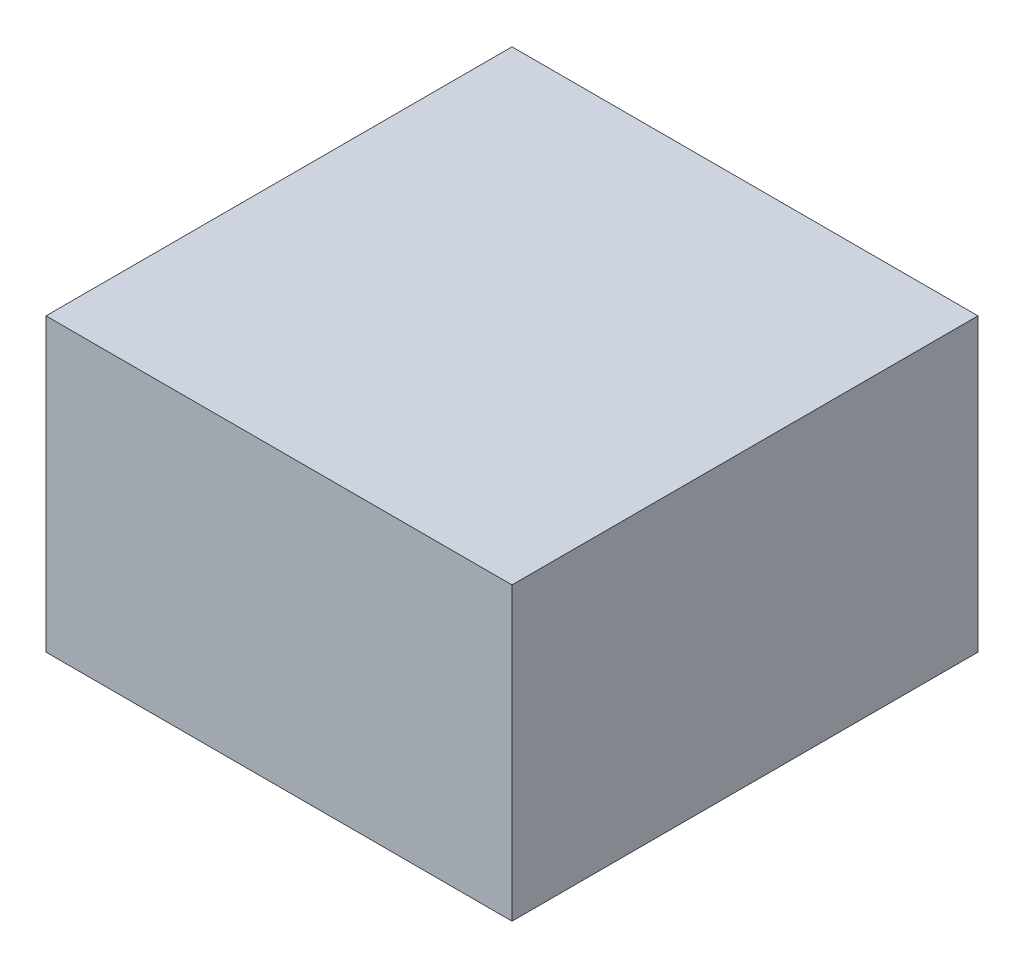
ISO-10303-21;
HEADER;
FILE_DESCRIPTION(('STEP AP214'),'2;1');
FILE_NAME('part.step','',(''),(''),'','','');
FILE_SCHEMA(('AUTOMOTIVE_DESIGN { 1 0 10303 214 1 1 1 1 }'));
ENDSEC;
DATA;
#1=APPLICATION_CONTEXT('core data for automotive mechanical design processes');
#2=APPLICATION_PROTOCOL_DEFINITION('international standard','automotive_design',2000,#1);
#3=PRODUCT_CONTEXT('',#1,'mechanical');
#4=PRODUCT('Part','Part','',(#3));
#5=PRODUCT_RELATED_PRODUCT_CATEGORY('part','',(#4));
#6=PRODUCT_DEFINITION_FORMATION('','',#4);
#7=PRODUCT_DEFINITION_CONTEXT('part definition',#1,'design');
#8=PRODUCT_DEFINITION('design','',#6,#7);
#9=PRODUCT_DEFINITION_SHAPE('','',#8);
#10=(LENGTH_UNIT() NAMED_UNIT(*) SI_UNIT(.MILLI.,.METRE.));
#11=(NAMED_UNIT(*) PLANE_ANGLE_UNIT() SI_UNIT($,.RADIAN.));
#12=(NAMED_UNIT(*) SI_UNIT($,.STERADIAN.) SOLID_ANGLE_UNIT());
#13=UNCERTAINTY_MEASURE_WITH_UNIT(LENGTH_MEASURE(1.E-05),#10,'distance_accuracy_value','');
#14=(GEOMETRIC_REPRESENTATION_CONTEXT(3) GLOBAL_UNCERTAINTY_ASSIGNED_CONTEXT((#13)) GLOBAL_UNIT_ASSIGNED_CONTEXT((#10,
#11,#12)) REPRESENTATION_CONTEXT('',''));
#15=CARTESIAN_POINT('',(0.,0.,0.));
#16=DIRECTION('',(0.,0.,1.));
#17=DIRECTION('',(1.,0.,0.));
#18=AXIS2_PLACEMENT_3D('',#15,#16,#17);
#19=CARTESIAN_POINT('',(40.,50.,-40.));
#20=DIRECTION('',(-1.,0.,0.));
#21=DIRECTION('',(0.,0.,1.));
#22=AXIS2_PLACEMENT_3D('',#19,#20,#21);
#23=PLANE('',#22);
#24=DIRECTION('',(0.,0.,-1.));
#25=VECTOR('',#24,1.);
#26=CARTESIAN_POINT('',(40.,0.,-40.));
#27=LINE('',#26,#25);
#28=CARTESIAN_POINT('',(40.,0.,40.));
#29=VERTEX_POINT('',#28);
#30=CARTESIAN_POINT('',(40.,0.,-40.));
#31=VERTEX_POINT('',#30);
#32=EDGE_CURVE('E105',#29,#31,#27,.T.);
#33=ORIENTED_EDGE('',*,*,#32,.T.);
#34=DIRECTION('',(0.,-1.,0.));
#35=VECTOR('',#34,1.);
#36=CARTESIAN_POINT('',(40.,50.,-40.));
#37=LINE('',#36,#35);
#38=CARTESIAN_POINT('',(40.,50.,-40.));
#39=VERTEX_POINT('',#38);
#40=EDGE_CURVE('E11',#39,#31,#37,.T.);
#41=ORIENTED_EDGE('',*,*,#40,.F.);
#42=DIRECTION('',(0.,0.,-1.));
#43=VECTOR('',#42,1.);
#44=CARTESIAN_POINT('',(40.,50.,-40.));
#45=LINE('',#44,#43);
#46=CARTESIAN_POINT('',(40.,50.,40.));
#47=VERTEX_POINT('',#46);
#48=EDGE_CURVE('E93',#47,#39,#45,.T.);
#49=ORIENTED_EDGE('',*,*,#48,.F.);
#50=DIRECTION('',(0.,-1.,0.));
#51=VECTOR('',#50,1.);
#52=CARTESIAN_POINT('',(40.,50.,40.));
#53=LINE('',#52,#51);
#54=EDGE_CURVE('E101',#47,#29,#53,.T.);
#55=ORIENTED_EDGE('',*,*,#54,.T.);
#56=EDGE_LOOP('',(#33,#41,#49,#55));
#57=FACE_BOUND('',#56,.T.);
#58=ADVANCED_FACE('F42',(#57),#23,.F.);
#59=CARTESIAN_POINT('',(-40.,50.,-40.));
#60=DIRECTION('',(0.,0.,1.));
#61=DIRECTION('',(1.,0.,0.));
#62=AXIS2_PLACEMENT_3D('',#59,#60,#61);
#63=PLANE('',#62);
#64=DIRECTION('',(-1.,0.,0.));
#65=VECTOR('',#64,1.);
#66=CARTESIAN_POINT('',(-40.,0.,-40.));
#67=LINE('',#66,#65);
#68=CARTESIAN_POINT('',(-40.,0.,-40.));
#69=VERTEX_POINT('',#68);
#70=EDGE_CURVE('E97',#31,#69,#67,.T.);
#71=ORIENTED_EDGE('',*,*,#70,.T.);
#72=DIRECTION('',(0.,-1.,0.));
#73=VECTOR('',#72,1.);
#74=CARTESIAN_POINT('',(-40.,50.,-40.));
#75=LINE('',#74,#73);
#76=CARTESIAN_POINT('',(-40.,50.,-40.));
#77=VERTEX_POINT('',#76);
#78=EDGE_CURVE('E50',#77,#69,#75,.T.);
#79=ORIENTED_EDGE('',*,*,#78,.F.);
#80=DIRECTION('',(-1.,0.,0.));
#81=VECTOR('',#80,1.);
#82=CARTESIAN_POINT('',(-40.,50.,-40.));
#83=LINE('',#82,#81);
#84=EDGE_CURVE('E88',#39,#77,#83,.T.);
#85=ORIENTED_EDGE('',*,*,#84,.F.);
#86=ORIENTED_EDGE('',*,*,#40,.T.);
#87=EDGE_LOOP('',(#71,#79,#85,#86));
#88=FACE_BOUND('',#87,.T.);
#89=ADVANCED_FACE('F96',(#88),#63,.F.);
#90=CARTESIAN_POINT('',(-40.,50.,-40.));
#91=DIRECTION('',(1.,0.,0.));
#92=DIRECTION('',(0.,0.,-1.));
#93=AXIS2_PLACEMENT_3D('',#90,#91,#92);
#94=PLANE('',#93);
#95=DIRECTION('',(0.,0.,1.));
#96=VECTOR('',#95,1.);
#97=CARTESIAN_POINT('',(-40.,0.,-40.));
#98=LINE('',#97,#96);
#99=CARTESIAN_POINT('',(-40.,0.,40.));
#100=VERTEX_POINT('',#99);
#101=EDGE_CURVE('E75',#69,#100,#98,.T.);
#102=ORIENTED_EDGE('',*,*,#101,.T.);
#103=DIRECTION('',(0.,-1.,0.));
#104=VECTOR('',#103,1.);
#105=CARTESIAN_POINT('',(-40.,50.,40.));
#106=LINE('',#105,#104);
#107=CARTESIAN_POINT('',(-40.,50.,40.));
#108=VERTEX_POINT('',#107);
#109=EDGE_CURVE('E98',#108,#100,#106,.T.);
#110=ORIENTED_EDGE('',*,*,#109,.F.);
#111=DIRECTION('',(0.,0.,1.));
#112=VECTOR('',#111,1.);
#113=CARTESIAN_POINT('',(-40.,50.,-40.));
#114=LINE('',#113,#112);
#115=EDGE_CURVE('E91',#77,#108,#114,.T.);
#116=ORIENTED_EDGE('',*,*,#115,.F.);
#117=ORIENTED_EDGE('',*,*,#78,.T.);
#118=EDGE_LOOP('',(#102,#110,#116,#117));
#119=FACE_BOUND('',#118,.T.);
#120=ADVANCED_FACE('F99',(#119),#94,.F.);
#121=CARTESIAN_POINT('',(-40.,50.,40.));
#122=DIRECTION('',(0.,0.,-1.));
#123=DIRECTION('',(-1.,0.,0.));
#124=AXIS2_PLACEMENT_3D('',#121,#122,#123);
#125=PLANE('',#124);
#126=DIRECTION('',(1.,0.,0.));
#127=VECTOR('',#126,1.);
#128=CARTESIAN_POINT('',(-40.,0.,40.));
#129=LINE('',#128,#127);
#130=EDGE_CURVE('E81',#100,#29,#129,.T.);
#131=ORIENTED_EDGE('',*,*,#130,.T.);
#132=ORIENTED_EDGE('',*,*,#54,.F.);
#133=DIRECTION('',(1.,0.,0.));
#134=VECTOR('',#133,1.);
#135=CARTESIAN_POINT('',(-40.,50.,40.));
#136=LINE('',#135,#134);
#137=EDGE_CURVE('E58',#108,#47,#136,.T.);
#138=ORIENTED_EDGE('',*,*,#137,.F.);
#139=ORIENTED_EDGE('',*,*,#109,.T.);
#140=EDGE_LOOP('',(#131,#132,#138,#139));
#141=FACE_BOUND('',#140,.T.);
#142=ADVANCED_FACE('F112',(#141),#125,.F.);
#143=CARTESIAN_POINT('',(0.,50.,0.));
#144=DIRECTION('',(0.,1.,0.));
#145=DIRECTION('',(0.,0.,1.));
#146=AXIS2_PLACEMENT_3D('',#143,#144,#145);
#147=PLANE('',#146);
#148=ORIENTED_EDGE('',*,*,#48,.T.);
#149=ORIENTED_EDGE('',*,*,#84,.T.);
#150=ORIENTED_EDGE('',*,*,#115,.T.);
#151=ORIENTED_EDGE('',*,*,#137,.T.);
#152=EDGE_LOOP('',(#148,#149,#150,#151));
#153=FACE_BOUND('',#152,.T.);
#154=ADVANCED_FACE('F89',(#153),#147,.T.);
#155=CARTESIAN_POINT('',(0.,0.,0.));
#156=DIRECTION('',(0.,1.,0.));
#157=DIRECTION('',(0.,0.,1.));
#158=AXIS2_PLACEMENT_3D('',#155,#156,#157);
#159=PLANE('',#158);
#160=ORIENTED_EDGE('',*,*,#32,.F.);
#161=ORIENTED_EDGE('',*,*,#130,.F.);
#162=ORIENTED_EDGE('',*,*,#101,.F.);
#163=ORIENTED_EDGE('',*,*,#70,.F.);
#164=EDGE_LOOP('',(#160,#161,#162,#163));
#165=FACE_BOUND('',#164,.T.);
#166=ADVANCED_FACE('F115',(#165),#159,.F.);
#167=CLOSED_SHELL('',(#58,#89,#120,#142,#154,#166));
#168=MANIFOLD_SOLID_BREP('B2',#167);
#169=ADVANCED_BREP_SHAPE_REPRESENTATION('',(#18,#168),#14);
#170=SHAPE_DEFINITION_REPRESENTATION(#9,#169);
ENDSEC;
END-ISO-10303-21;
